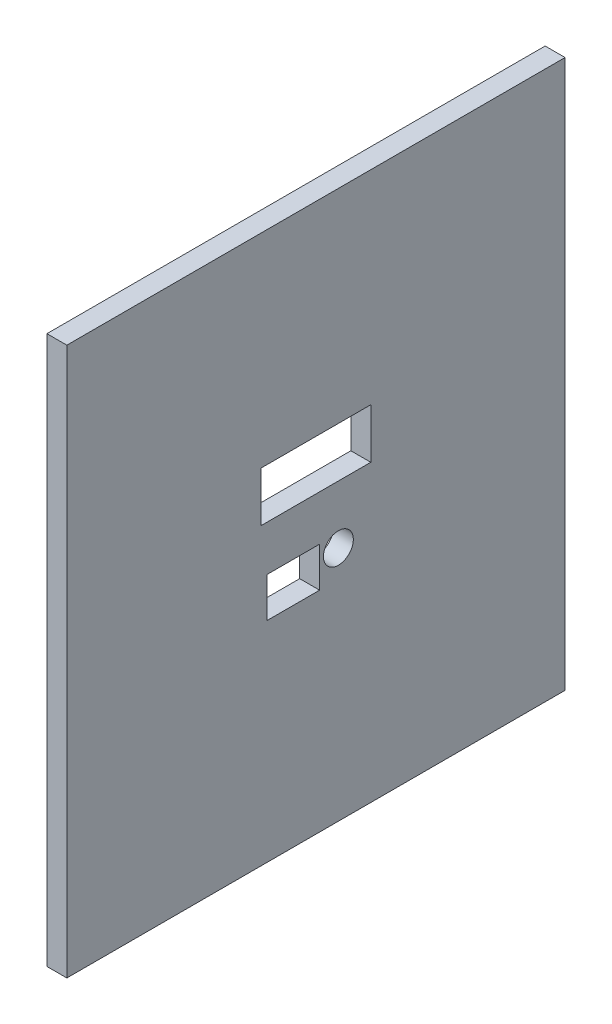
ISO-10303-21;
HEADER;
FILE_DESCRIPTION(('STEP AP214'),'2;1');
FILE_NAME('part.step','',(''),(''),'','','');
FILE_SCHEMA(('AUTOMOTIVE_DESIGN { 1 0 10303 214 1 1 1 1 }'));
ENDSEC;
DATA;
#1=APPLICATION_CONTEXT('core data for automotive mechanical design processes');
#2=APPLICATION_PROTOCOL_DEFINITION('international standard','automotive_design',2000,#1);
#3=PRODUCT_CONTEXT('',#1,'mechanical');
#4=PRODUCT('Part','Part','',(#3));
#5=PRODUCT_RELATED_PRODUCT_CATEGORY('part','',(#4));
#6=PRODUCT_DEFINITION_FORMATION('','',#4);
#7=PRODUCT_DEFINITION_CONTEXT('part definition',#1,'design');
#8=PRODUCT_DEFINITION('design','',#6,#7);
#9=PRODUCT_DEFINITION_SHAPE('','',#8);
#10=(LENGTH_UNIT() NAMED_UNIT(*) SI_UNIT(.MILLI.,.METRE.));
#11=(NAMED_UNIT(*) PLANE_ANGLE_UNIT() SI_UNIT($,.RADIAN.));
#12=(NAMED_UNIT(*) SI_UNIT($,.STERADIAN.) SOLID_ANGLE_UNIT());
#13=UNCERTAINTY_MEASURE_WITH_UNIT(LENGTH_MEASURE(1.E-05),#10,'distance_accuracy_value','');
#14=(GEOMETRIC_REPRESENTATION_CONTEXT(3) GLOBAL_UNCERTAINTY_ASSIGNED_CONTEXT((#13)) GLOBAL_UNIT_ASSIGNED_CONTEXT((#10,
#11,#12)) REPRESENTATION_CONTEXT('',''));
#15=CARTESIAN_POINT('',(0.,0.,0.));
#16=DIRECTION('',(0.,0.,1.));
#17=DIRECTION('',(1.,0.,0.));
#18=AXIS2_PLACEMENT_3D('',#15,#16,#17);
#19=CARTESIAN_POINT('',(2.,0.,0.));
#20=DIRECTION('',(1.,0.,0.));
#21=DIRECTION('',(0.,0.,-1.));
#22=AXIS2_PLACEMENT_3D('',#19,#20,#21);
#23=PLANE('',#22);
#24=DIRECTION('',(0.,0.,1.));
#25=VECTOR('',#24,1.);
#26=CARTESIAN_POINT('',(2.,-6.47676331938909,0.));
#27=LINE('',#26,#25);
#28=CARTESIAN_POINT('',(2.,-6.47676331938909,-0.365682157442761));
#29=VERTEX_POINT('',#28);
#30=CARTESIAN_POINT('',(2.,-6.47676331938909,4.93431784255724));
#31=VERTEX_POINT('',#30);
#32=EDGE_CURVE('E153',#29,#31,#27,.T.);
#33=ORIENTED_EDGE('',*,*,#32,.T.);
#34=DIRECTION('',(0.,1.,0.));
#35=VECTOR('',#34,1.);
#36=CARTESIAN_POINT('',(2.,0.,4.93431784255724));
#37=LINE('',#36,#35);
#38=CARTESIAN_POINT('',(2.,-2.47676331938909,4.93431784255724));
#39=VERTEX_POINT('',#38);
#40=EDGE_CURVE('E150',#31,#39,#37,.T.);
#41=ORIENTED_EDGE('',*,*,#40,.T.);
#42=DIRECTION('',(0.,0.,1.));
#43=VECTOR('',#42,1.);
#44=CARTESIAN_POINT('',(2.,-2.47676331938909,0.));
#45=LINE('',#44,#43);
#46=CARTESIAN_POINT('',(2.,-2.47676331938909,-0.365682157442761));
#47=VERTEX_POINT('',#46);
#48=EDGE_CURVE('E159',#47,#39,#45,.T.);
#49=ORIENTED_EDGE('',*,*,#48,.F.);
#50=DIRECTION('',(0.,1.,0.));
#51=VECTOR('',#50,1.);
#52=CARTESIAN_POINT('',(2.,0.,-0.365682157442761));
#53=LINE('',#52,#51);
#54=EDGE_CURVE('E156',#29,#47,#53,.T.);
#55=ORIENTED_EDGE('',*,*,#54,.F.);
#56=EDGE_LOOP('',(#33,#41,#49,#55));
#57=FACE_BOUND('',#56,.T.);
#58=DIRECTION('',(0.,-1.,0.));
#59=VECTOR('',#58,1.);
#60=CARTESIAN_POINT('',(2.,-27.5,25.));
#61=LINE('',#60,#59);
#62=CARTESIAN_POINT('',(2.,27.5,25.));
#63=VERTEX_POINT('',#62);
#64=CARTESIAN_POINT('',(2.,-27.5,25.));
#65=VERTEX_POINT('',#64);
#66=EDGE_CURVE('E172',#63,#65,#61,.T.);
#67=ORIENTED_EDGE('',*,*,#66,.T.);
#68=DIRECTION('',(0.,0.,-1.));
#69=VECTOR('',#68,1.);
#70=CARTESIAN_POINT('',(2.,-27.5,-25.));
#71=LINE('',#70,#69);
#72=CARTESIAN_POINT('',(2.,-27.5,-25.));
#73=VERTEX_POINT('',#72);
#74=EDGE_CURVE('E175',#65,#73,#71,.T.);
#75=ORIENTED_EDGE('',*,*,#74,.T.);
#76=DIRECTION('',(0.,1.,0.));
#77=VECTOR('',#76,1.);
#78=CARTESIAN_POINT('',(2.,-27.5,-25.));
#79=LINE('',#78,#77);
#80=CARTESIAN_POINT('',(2.,27.5,-25.));
#81=VERTEX_POINT('',#80);
#82=EDGE_CURVE('E178',#73,#81,#79,.T.);
#83=ORIENTED_EDGE('',*,*,#82,.T.);
#84=DIRECTION('',(0.,0.,1.));
#85=VECTOR('',#84,1.);
#86=CARTESIAN_POINT('',(2.,27.5,-25.));
#87=LINE('',#86,#85);
#88=EDGE_CURVE('E180',#81,#63,#87,.T.);
#89=ORIENTED_EDGE('',*,*,#88,.T.);
#90=EDGE_LOOP('',(#67,#75,#83,#89));
#91=FACE_BOUND('',#90,.T.);
#92=CARTESIAN_POINT('',(2.,-3.75,-2.25));
#93=DIRECTION('',(1.,0.,0.));
#94=DIRECTION('',(0.,0.,-1.));
#95=AXIS2_PLACEMENT_3D('',#92,#93,#94);
#96=CIRCLE('',#95,1.5);
#97=CARTESIAN_POINT('',(2.,-3.75,-3.75));
#98=VERTEX_POINT('',#97);
#99=EDGE_CURVE('E144',#98,#98,#96,.T.);
#100=ORIENTED_EDGE('',*,*,#99,.F.);
#101=EDGE_LOOP('',(#100));
#102=FACE_BOUND('',#101,.T.);
#103=DIRECTION('',(0.,1.,0.));
#104=VECTOR('',#103,1.);
#105=CARTESIAN_POINT('',(2.,0.,-5.5));
#106=LINE('',#105,#104);
#107=CARTESIAN_POINT('',(2.,2.07142857142857,-5.5));
#108=VERTEX_POINT('',#107);
#109=CARTESIAN_POINT('',(2.,7.07142857142857,-5.5));
#110=VERTEX_POINT('',#109);
#111=EDGE_CURVE('E132',#108,#110,#106,.T.);
#112=ORIENTED_EDGE('',*,*,#111,.F.);
#113=DIRECTION('',(0.,0.,1.));
#114=VECTOR('',#113,1.);
#115=CARTESIAN_POINT('',(2.,2.07142857142857,0.));
#116=LINE('',#115,#114);
#117=CARTESIAN_POINT('',(2.,2.07142857142857,5.5));
#118=VERTEX_POINT('',#117);
#119=EDGE_CURVE('E47',#108,#118,#116,.T.);
#120=ORIENTED_EDGE('',*,*,#119,.T.);
#121=DIRECTION('',(0.,1.,0.));
#122=VECTOR('',#121,1.);
#123=CARTESIAN_POINT('',(2.,0.,5.5));
#124=LINE('',#123,#122);
#125=CARTESIAN_POINT('',(2.,7.07142857142857,5.5));
#126=VERTEX_POINT('',#125);
#127=EDGE_CURVE('E137',#118,#126,#124,.T.);
#128=ORIENTED_EDGE('',*,*,#127,.T.);
#129=DIRECTION('',(0.,0.,1.));
#130=VECTOR('',#129,1.);
#131=CARTESIAN_POINT('',(2.,7.07142857142857,0.));
#132=LINE('',#131,#130);
#133=EDGE_CURVE('E123',#110,#126,#132,.T.);
#134=ORIENTED_EDGE('',*,*,#133,.F.);
#135=EDGE_LOOP('',(#112,#120,#128,#134));
#136=FACE_BOUND('',#135,.T.);
#137=ADVANCED_FACE('F32',(#57,#91,#102,#136),#23,.T.);
#138=CARTESIAN_POINT('',(0.,0.,0.));
#139=DIRECTION('',(1.,0.,0.));
#140=DIRECTION('',(0.,0.,-1.));
#141=AXIS2_PLACEMENT_3D('',#138,#139,#140);
#142=PLANE('',#141);
#143=DIRECTION('',(0.,1.,0.));
#144=VECTOR('',#143,1.);
#145=CARTESIAN_POINT('',(0.,0.,4.93431784255724));
#146=LINE('',#145,#144);
#147=CARTESIAN_POINT('',(0.,-6.47676331938909,4.93431784255724));
#148=VERTEX_POINT('',#147);
#149=CARTESIAN_POINT('',(0.,-2.47676331938909,4.93431784255724));
#150=VERTEX_POINT('',#149);
#151=EDGE_CURVE('E209',#148,#150,#146,.T.);
#152=ORIENTED_EDGE('',*,*,#151,.F.);
#153=DIRECTION('',(0.,0.,1.));
#154=VECTOR('',#153,1.);
#155=CARTESIAN_POINT('',(0.,-6.47676331938909,0.));
#156=LINE('',#155,#154);
#157=CARTESIAN_POINT('',(0.,-6.47676331938909,-0.365682157442761));
#158=VERTEX_POINT('',#157);
#159=EDGE_CURVE('E201',#158,#148,#156,.T.);
#160=ORIENTED_EDGE('',*,*,#159,.F.);
#161=DIRECTION('',(0.,1.,0.));
#162=VECTOR('',#161,1.);
#163=CARTESIAN_POINT('',(0.,0.,-0.365682157442761));
#164=LINE('',#163,#162);
#165=CARTESIAN_POINT('',(0.,-2.47676331938909,-0.365682157442761));
#166=VERTEX_POINT('',#165);
#167=EDGE_CURVE('E203',#158,#166,#164,.T.);
#168=ORIENTED_EDGE('',*,*,#167,.T.);
#169=DIRECTION('',(0.,0.,1.));
#170=VECTOR('',#169,1.);
#171=CARTESIAN_POINT('',(0.,-2.47676331938909,0.));
#172=LINE('',#171,#170);
#173=EDGE_CURVE('E206',#166,#150,#172,.T.);
#174=ORIENTED_EDGE('',*,*,#173,.T.);
#175=EDGE_LOOP('',(#152,#160,#168,#174));
#176=FACE_BOUND('',#175,.T.);
#177=DIRECTION('',(0.,-1.,0.));
#178=VECTOR('',#177,1.);
#179=CARTESIAN_POINT('',(0.,-27.5,25.));
#180=LINE('',#179,#178);
#181=CARTESIAN_POINT('',(0.,27.5,25.));
#182=VERTEX_POINT('',#181);
#183=CARTESIAN_POINT('',(0.,-27.5,25.));
#184=VERTEX_POINT('',#183);
#185=EDGE_CURVE('E165',#182,#184,#180,.T.);
#186=ORIENTED_EDGE('',*,*,#185,.F.);
#187=DIRECTION('',(0.,0.,1.));
#188=VECTOR('',#187,1.);
#189=CARTESIAN_POINT('',(0.,27.5,-25.));
#190=LINE('',#189,#188);
#191=CARTESIAN_POINT('',(0.,27.5,-25.));
#192=VERTEX_POINT('',#191);
#193=EDGE_CURVE('E176',#192,#182,#190,.T.);
#194=ORIENTED_EDGE('',*,*,#193,.F.);
#195=DIRECTION('',(0.,1.,0.));
#196=VECTOR('',#195,1.);
#197=CARTESIAN_POINT('',(0.,-27.5,-25.));
#198=LINE('',#197,#196);
#199=CARTESIAN_POINT('',(0.,-27.5,-25.));
#200=VERTEX_POINT('',#199);
#201=EDGE_CURVE('E187',#200,#192,#198,.T.);
#202=ORIENTED_EDGE('',*,*,#201,.F.);
#203=DIRECTION('',(0.,0.,-1.));
#204=VECTOR('',#203,1.);
#205=CARTESIAN_POINT('',(0.,-27.5,-25.));
#206=LINE('',#205,#204);
#207=EDGE_CURVE('E185',#184,#200,#206,.T.);
#208=ORIENTED_EDGE('',*,*,#207,.F.);
#209=EDGE_LOOP('',(#186,#194,#202,#208));
#210=FACE_BOUND('',#209,.T.);
#211=CARTESIAN_POINT('',(0.,-3.75,-2.25));
#212=DIRECTION('',(1.,0.,0.));
#213=DIRECTION('',(0.,0.,-1.));
#214=AXIS2_PLACEMENT_3D('',#211,#212,#213);
#215=CIRCLE('',#214,1.5);
#216=CARTESIAN_POINT('',(0.,-3.75,-3.75));
#217=VERTEX_POINT('',#216);
#218=EDGE_CURVE('E149',#217,#217,#215,.T.);
#219=ORIENTED_EDGE('',*,*,#218,.T.);
#220=EDGE_LOOP('',(#219));
#221=FACE_BOUND('',#220,.T.);
#222=DIRECTION('',(0.,0.,1.));
#223=VECTOR('',#222,1.);
#224=CARTESIAN_POINT('',(0.,2.07142857142857,0.));
#225=LINE('',#224,#223);
#226=CARTESIAN_POINT('',(0.,2.07142857142857,-5.5));
#227=VERTEX_POINT('',#226);
#228=CARTESIAN_POINT('',(0.,2.07142857142857,5.5));
#229=VERTEX_POINT('',#228);
#230=EDGE_CURVE('E11',#227,#229,#225,.T.);
#231=ORIENTED_EDGE('',*,*,#230,.F.);
#232=DIRECTION('',(0.,1.,0.));
#233=VECTOR('',#232,1.);
#234=CARTESIAN_POINT('',(0.,0.,-5.5));
#235=LINE('',#234,#233);
#236=CARTESIAN_POINT('',(0.,7.07142857142857,-5.5));
#237=VERTEX_POINT('',#236);
#238=EDGE_CURVE('E211',#227,#237,#235,.T.);
#239=ORIENTED_EDGE('',*,*,#238,.T.);
#240=DIRECTION('',(0.,0.,1.));
#241=VECTOR('',#240,1.);
#242=CARTESIAN_POINT('',(0.,7.07142857142857,0.));
#243=LINE('',#242,#241);
#244=CARTESIAN_POINT('',(0.,7.07142857142857,5.5));
#245=VERTEX_POINT('',#244);
#246=EDGE_CURVE('E126',#237,#245,#243,.T.);
#247=ORIENTED_EDGE('',*,*,#246,.T.);
#248=DIRECTION('',(0.,1.,0.));
#249=VECTOR('',#248,1.);
#250=CARTESIAN_POINT('',(0.,0.,5.5));
#251=LINE('',#250,#249);
#252=EDGE_CURVE('E40',#229,#245,#251,.T.);
#253=ORIENTED_EDGE('',*,*,#252,.F.);
#254=EDGE_LOOP('',(#231,#239,#247,#253));
#255=FACE_BOUND('',#254,.T.);
#256=ADVANCED_FACE('F221',(#176,#210,#221,#255),#142,.F.);
#257=CARTESIAN_POINT('',(2.,-27.5,25.));
#258=DIRECTION('',(0.,0.,-1.));
#259=DIRECTION('',(0.,1.,0.));
#260=AXIS2_PLACEMENT_3D('',#257,#258,#259);
#261=PLANE('',#260);
#262=ORIENTED_EDGE('',*,*,#185,.T.);
#263=DIRECTION('',(-1.,0.,0.));
#264=VECTOR('',#263,1.);
#265=CARTESIAN_POINT('',(2.,-27.5,25.));
#266=LINE('',#265,#264);
#267=EDGE_CURVE('E198',#65,#184,#266,.T.);
#268=ORIENTED_EDGE('',*,*,#267,.F.);
#269=ORIENTED_EDGE('',*,*,#66,.F.);
#270=DIRECTION('',(-1.,0.,0.));
#271=VECTOR('',#270,1.);
#272=CARTESIAN_POINT('',(2.,27.5,25.));
#273=LINE('',#272,#271);
#274=EDGE_CURVE('E182',#63,#182,#273,.T.);
#275=ORIENTED_EDGE('',*,*,#274,.T.);
#276=EDGE_LOOP('',(#262,#268,#269,#275));
#277=FACE_BOUND('',#276,.T.);
#278=ADVANCED_FACE('F34',(#277),#261,.F.);
#279=CARTESIAN_POINT('',(2.,-27.5,-25.));
#280=DIRECTION('',(0.,1.,0.));
#281=DIRECTION('',(0.,0.,1.));
#282=AXIS2_PLACEMENT_3D('',#279,#280,#281);
#283=PLANE('',#282);
#284=ORIENTED_EDGE('',*,*,#207,.T.);
#285=DIRECTION('',(-1.,0.,0.));
#286=VECTOR('',#285,1.);
#287=CARTESIAN_POINT('',(2.,-27.5,-25.));
#288=LINE('',#287,#286);
#289=EDGE_CURVE('E195',#73,#200,#288,.T.);
#290=ORIENTED_EDGE('',*,*,#289,.F.);
#291=ORIENTED_EDGE('',*,*,#74,.F.);
#292=ORIENTED_EDGE('',*,*,#267,.T.);
#293=EDGE_LOOP('',(#284,#290,#291,#292));
#294=FACE_BOUND('',#293,.T.);
#295=ADVANCED_FACE('F255',(#294),#283,.F.);
#296=CARTESIAN_POINT('',(2.,-27.5,-25.));
#297=DIRECTION('',(0.,0.,1.));
#298=DIRECTION('',(1.,0.,0.));
#299=AXIS2_PLACEMENT_3D('',#296,#297,#298);
#300=PLANE('',#299);
#301=ORIENTED_EDGE('',*,*,#201,.T.);
#302=DIRECTION('',(-1.,0.,0.));
#303=VECTOR('',#302,1.);
#304=CARTESIAN_POINT('',(2.,27.5,-25.));
#305=LINE('',#304,#303);
#306=EDGE_CURVE('E192',#81,#192,#305,.T.);
#307=ORIENTED_EDGE('',*,*,#306,.F.);
#308=ORIENTED_EDGE('',*,*,#82,.F.);
#309=ORIENTED_EDGE('',*,*,#289,.T.);
#310=EDGE_LOOP('',(#301,#307,#308,#309));
#311=FACE_BOUND('',#310,.T.);
#312=ADVANCED_FACE('F252',(#311),#300,.F.);
#313=CARTESIAN_POINT('',(2.,27.5,-25.));
#314=DIRECTION('',(0.,-1.,0.));
#315=DIRECTION('',(0.,0.,-1.));
#316=AXIS2_PLACEMENT_3D('',#313,#314,#315);
#317=PLANE('',#316);
#318=ORIENTED_EDGE('',*,*,#193,.T.);
#319=ORIENTED_EDGE('',*,*,#274,.F.);
#320=ORIENTED_EDGE('',*,*,#88,.F.);
#321=ORIENTED_EDGE('',*,*,#306,.T.);
#322=EDGE_LOOP('',(#318,#319,#320,#321));
#323=FACE_BOUND('',#322,.T.);
#324=ADVANCED_FACE('F249',(#323),#317,.F.);
#325=CARTESIAN_POINT('',(-8.,0.,4.93431784255724));
#326=DIRECTION('',(0.,0.,-1.));
#327=DIRECTION('',(0.,1.,0.));
#328=AXIS2_PLACEMENT_3D('',#325,#326,#327);
#329=PLANE('',#328);
#330=ORIENTED_EDGE('',*,*,#151,.T.);
#331=DIRECTION('',(1.,0.,0.));
#332=VECTOR('',#331,1.);
#333=CARTESIAN_POINT('',(-8.,-2.47676331938909,4.93431784255724));
#334=LINE('',#333,#332);
#335=EDGE_CURVE('E163',#150,#39,#334,.T.);
#336=ORIENTED_EDGE('',*,*,#335,.T.);
#337=ORIENTED_EDGE('',*,*,#40,.F.);
#338=DIRECTION('',(1.,0.,0.));
#339=VECTOR('',#338,1.);
#340=CARTESIAN_POINT('',(-8.,-6.47676331938909,4.93431784255724));
#341=LINE('',#340,#339);
#342=EDGE_CURVE('E162',#148,#31,#341,.T.);
#343=ORIENTED_EDGE('',*,*,#342,.F.);
#344=EDGE_LOOP('',(#330,#336,#337,#343));
#345=FACE_BOUND('',#344,.T.);
#346=ADVANCED_FACE('F246',(#345),#329,.T.);
#347=CARTESIAN_POINT('',(-8.,-2.47676331938909,0.));
#348=DIRECTION('',(0.,1.,0.));
#349=DIRECTION('',(0.,0.,1.));
#350=AXIS2_PLACEMENT_3D('',#347,#348,#349);
#351=PLANE('',#350);
#352=DIRECTION('',(1.,0.,0.));
#353=VECTOR('',#352,1.);
#354=CARTESIAN_POINT('',(-8.,-2.47676331938909,-0.365682157442761));
#355=LINE('',#354,#353);
#356=EDGE_CURVE('E166',#166,#47,#355,.T.);
#357=ORIENTED_EDGE('',*,*,#356,.T.);
#358=ORIENTED_EDGE('',*,*,#48,.T.);
#359=ORIENTED_EDGE('',*,*,#335,.F.);
#360=ORIENTED_EDGE('',*,*,#173,.F.);
#361=EDGE_LOOP('',(#357,#358,#359,#360));
#362=FACE_BOUND('',#361,.T.);
#363=ADVANCED_FACE('F315',(#362),#351,.F.);
#364=CARTESIAN_POINT('',(-8.,0.,-0.365682157442761));
#365=DIRECTION('',(0.,0.,-1.));
#366=DIRECTION('',(-1.,0.,0.));
#367=AXIS2_PLACEMENT_3D('',#364,#365,#366);
#368=PLANE('',#367);
#369=DIRECTION('',(1.,0.,0.));
#370=VECTOR('',#369,1.);
#371=CARTESIAN_POINT('',(-8.,-6.47676331938909,-0.365682157442761));
#372=LINE('',#371,#370);
#373=EDGE_CURVE('E168',#158,#29,#372,.T.);
#374=ORIENTED_EDGE('',*,*,#373,.T.);
#375=ORIENTED_EDGE('',*,*,#54,.T.);
#376=ORIENTED_EDGE('',*,*,#356,.F.);
#377=ORIENTED_EDGE('',*,*,#167,.F.);
#378=EDGE_LOOP('',(#374,#375,#376,#377));
#379=FACE_BOUND('',#378,.T.);
#380=ADVANCED_FACE('F321',(#379),#368,.F.);
#381=CARTESIAN_POINT('',(-8.,-6.47676331938909,0.));
#382=DIRECTION('',(0.,1.,0.));
#383=DIRECTION('',(0.,0.,1.));
#384=AXIS2_PLACEMENT_3D('',#381,#382,#383);
#385=PLANE('',#384);
#386=ORIENTED_EDGE('',*,*,#159,.T.);
#387=ORIENTED_EDGE('',*,*,#342,.T.);
#388=ORIENTED_EDGE('',*,*,#32,.F.);
#389=ORIENTED_EDGE('',*,*,#373,.F.);
#390=EDGE_LOOP('',(#386,#387,#388,#389));
#391=FACE_BOUND('',#390,.T.);
#392=ADVANCED_FACE('F231',(#391),#385,.T.);
#393=CARTESIAN_POINT('',(-8.,-3.75,-2.25));
#394=DIRECTION('',(1.,0.,0.));
#395=DIRECTION('',(0.,0.,-1.));
#396=AXIS2_PLACEMENT_3D('',#393,#394,#395);
#397=CYLINDRICAL_SURFACE('',#396,1.5);
#398=ORIENTED_EDGE('',*,*,#99,.T.);
#399=EDGE_LOOP('',(#398));
#400=FACE_BOUND('',#399,.T.);
#401=ORIENTED_EDGE('',*,*,#218,.F.);
#402=EDGE_LOOP('',(#401));
#403=FACE_BOUND('',#402,.T.);
#404=ADVANCED_FACE('F224',(#400,#403),#397,.F.);
#405=CARTESIAN_POINT('',(-8.,2.07142857142857,0.));
#406=DIRECTION('',(0.,1.,0.));
#407=DIRECTION('',(0.,0.,1.));
#408=AXIS2_PLACEMENT_3D('',#405,#406,#407);
#409=PLANE('',#408);
#410=ORIENTED_EDGE('',*,*,#230,.T.);
#411=DIRECTION('',(1.,0.,0.));
#412=VECTOR('',#411,1.);
#413=CARTESIAN_POINT('',(-8.,2.07142857142857,5.5));
#414=LINE('',#413,#412);
#415=EDGE_CURVE('E142',#229,#118,#414,.T.);
#416=ORIENTED_EDGE('',*,*,#415,.T.);
#417=ORIENTED_EDGE('',*,*,#119,.F.);
#418=DIRECTION('',(1.,0.,0.));
#419=VECTOR('',#418,1.);
#420=CARTESIAN_POINT('',(-8.,2.07142857142857,-5.5));
#421=LINE('',#420,#419);
#422=EDGE_CURVE('E129',#227,#108,#421,.T.);
#423=ORIENTED_EDGE('',*,*,#422,.F.);
#424=EDGE_LOOP('',(#410,#416,#417,#423));
#425=FACE_BOUND('',#424,.T.);
#426=ADVANCED_FACE('F222',(#425),#409,.T.);
#427=CARTESIAN_POINT('',(-8.,0.,5.5));
#428=DIRECTION('',(0.,0.,-1.));
#429=DIRECTION('',(0.,1.,0.));
#430=AXIS2_PLACEMENT_3D('',#427,#428,#429);
#431=PLANE('',#430);
#432=ORIENTED_EDGE('',*,*,#252,.T.);
#433=DIRECTION('',(1.,0.,0.));
#434=VECTOR('',#433,1.);
#435=CARTESIAN_POINT('',(-8.,7.07142857142857,5.5));
#436=LINE('',#435,#434);
#437=EDGE_CURVE('E128',#245,#126,#436,.T.);
#438=ORIENTED_EDGE('',*,*,#437,.T.);
#439=ORIENTED_EDGE('',*,*,#127,.F.);
#440=ORIENTED_EDGE('',*,*,#415,.F.);
#441=EDGE_LOOP('',(#432,#438,#439,#440));
#442=FACE_BOUND('',#441,.T.);
#443=ADVANCED_FACE('F218',(#442),#431,.T.);
#444=CARTESIAN_POINT('',(-8.,7.07142857142857,0.));
#445=DIRECTION('',(0.,1.,0.));
#446=DIRECTION('',(0.,0.,1.));
#447=AXIS2_PLACEMENT_3D('',#444,#445,#446);
#448=PLANE('',#447);
#449=DIRECTION('',(1.,0.,0.));
#450=VECTOR('',#449,1.);
#451=CARTESIAN_POINT('',(-8.,7.07142857142857,-5.5));
#452=LINE('',#451,#450);
#453=EDGE_CURVE('E55',#237,#110,#452,.T.);
#454=ORIENTED_EDGE('',*,*,#453,.T.);
#455=ORIENTED_EDGE('',*,*,#133,.T.);
#456=ORIENTED_EDGE('',*,*,#437,.F.);
#457=ORIENTED_EDGE('',*,*,#246,.F.);
#458=EDGE_LOOP('',(#454,#455,#456,#457));
#459=FACE_BOUND('',#458,.T.);
#460=ADVANCED_FACE('F120',(#459),#448,.F.);
#461=CARTESIAN_POINT('',(-8.,0.,-5.5));
#462=DIRECTION('',(0.,0.,-1.));
#463=DIRECTION('',(0.,1.,0.));
#464=AXIS2_PLACEMENT_3D('',#461,#462,#463);
#465=PLANE('',#464);
#466=ORIENTED_EDGE('',*,*,#422,.T.);
#467=ORIENTED_EDGE('',*,*,#111,.T.);
#468=ORIENTED_EDGE('',*,*,#453,.F.);
#469=ORIENTED_EDGE('',*,*,#238,.F.);
#470=EDGE_LOOP('',(#466,#467,#468,#469));
#471=FACE_BOUND('',#470,.T.);
#472=ADVANCED_FACE('F133',(#471),#465,.F.);
#473=CLOSED_SHELL('',(#137,#256,#278,#295,#312,#324,#346,#363,#380,#392,#404,#426,#443,#460,#472));
#474=MANIFOLD_SOLID_BREP('B2',#473);
#475=ADVANCED_BREP_SHAPE_REPRESENTATION('',(#18,#474),#14);
#476=SHAPE_DEFINITION_REPRESENTATION(#9,#475);
ENDSEC;
END-ISO-10303-21;
